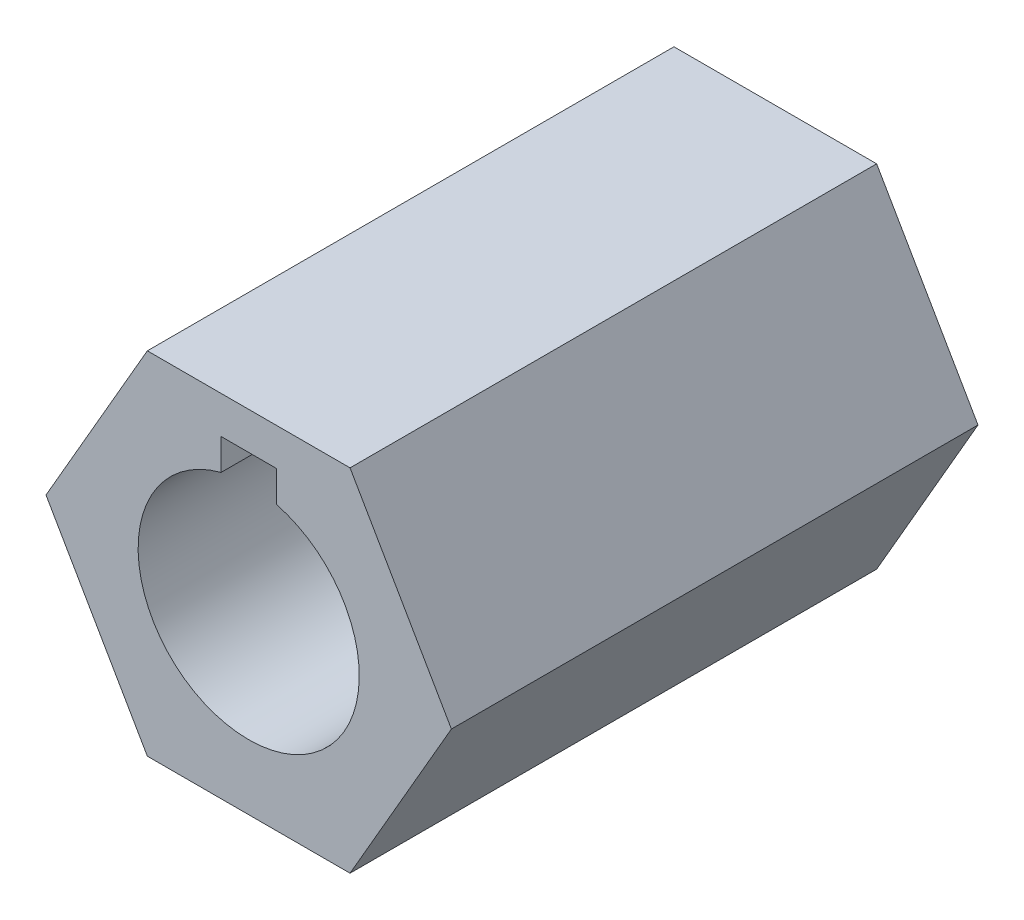
ISO-10303-21;
HEADER;
FILE_DESCRIPTION(('STEP AP214'),'2;1');
FILE_NAME('part.step','',(''),(''),'','','');
FILE_SCHEMA(('AUTOMOTIVE_DESIGN { 1 0 10303 214 1 1 1 1 }'));
ENDSEC;
DATA;
#1=APPLICATION_CONTEXT('core data for automotive mechanical design processes');
#2=APPLICATION_PROTOCOL_DEFINITION('international standard','automotive_design',2000,#1);
#3=PRODUCT_CONTEXT('',#1,'mechanical');
#4=PRODUCT('Part','Part','',(#3));
#5=PRODUCT_RELATED_PRODUCT_CATEGORY('part','',(#4));
#6=PRODUCT_DEFINITION_FORMATION('','',#4);
#7=PRODUCT_DEFINITION_CONTEXT('part definition',#1,'design');
#8=PRODUCT_DEFINITION('design','',#6,#7);
#9=PRODUCT_DEFINITION_SHAPE('','',#8);
#10=(LENGTH_UNIT() NAMED_UNIT(*) SI_UNIT(.MILLI.,.METRE.));
#11=(NAMED_UNIT(*) PLANE_ANGLE_UNIT() SI_UNIT($,.RADIAN.));
#12=(NAMED_UNIT(*) SI_UNIT($,.STERADIAN.) SOLID_ANGLE_UNIT());
#13=UNCERTAINTY_MEASURE_WITH_UNIT(LENGTH_MEASURE(1.E-05),#10,'distance_accuracy_value','');
#14=(GEOMETRIC_REPRESENTATION_CONTEXT(3) GLOBAL_UNCERTAINTY_ASSIGNED_CONTEXT((#13)) GLOBAL_UNIT_ASSIGNED_CONTEXT((#10,
#11,#12)) REPRESENTATION_CONTEXT('',''));
#15=CARTESIAN_POINT('',(0.,0.,0.));
#16=DIRECTION('',(0.,0.,1.));
#17=DIRECTION('',(1.,0.,0.));
#18=AXIS2_PLACEMENT_3D('',#15,#16,#17);
#19=CARTESIAN_POINT('',(0.,-6.34999999999997,19.05));
#20=DIRECTION('',(0.,1.,0.));
#21=DIRECTION('',(-1.,0.,0.));
#22=AXIS2_PLACEMENT_3D('',#19,#20,#21);
#23=PLANE('',#22);
#24=DIRECTION('',(1.,0.,0.));
#25=VECTOR('',#24,1.);
#26=CARTESIAN_POINT('',(0.,-6.34999999999997,0.));
#27=LINE('',#26,#25);
#28=CARTESIAN_POINT('',(-3.66617420935405,-6.35000000000001,0.));
#29=VERTEX_POINT('',#28);
#30=CARTESIAN_POINT('',(3.66617420935418,-6.34999999999993,0.));
#31=VERTEX_POINT('',#30);
#32=EDGE_CURVE('E161',#29,#31,#27,.T.);
#33=ORIENTED_EDGE('',*,*,#32,.T.);
#34=DIRECTION('',(0.,0.,-1.));
#35=VECTOR('',#34,1.);
#36=CARTESIAN_POINT('',(3.66617420935418,-6.34999999999993,19.05));
#37=LINE('',#36,#35);
#38=CARTESIAN_POINT('',(3.66617420935418,-6.34999999999993,19.05));
#39=VERTEX_POINT('',#38);
#40=EDGE_CURVE('E11',#39,#31,#37,.T.);
#41=ORIENTED_EDGE('',*,*,#40,.F.);
#42=DIRECTION('',(1.,0.,0.));
#43=VECTOR('',#42,1.);
#44=CARTESIAN_POINT('',(0.,-6.34999999999997,19.05));
#45=LINE('',#44,#43);
#46=CARTESIAN_POINT('',(-3.66617420935405,-6.35000000000001,19.05));
#47=VERTEX_POINT('',#46);
#48=EDGE_CURVE('E241',#47,#39,#45,.T.);
#49=ORIENTED_EDGE('',*,*,#48,.F.);
#50=DIRECTION('',(0.,0.,-1.));
#51=VECTOR('',#50,1.);
#52=CARTESIAN_POINT('',(-3.66617420935405,-6.35000000000001,19.05));
#53=LINE('',#52,#51);
#54=EDGE_CURVE('E172',#47,#29,#53,.T.);
#55=ORIENTED_EDGE('',*,*,#54,.T.);
#56=EDGE_LOOP('',(#33,#41,#49,#55));
#57=FACE_BOUND('',#56,.T.);
#58=ADVANCED_FACE('F37',(#57),#23,.F.);
#59=CARTESIAN_POINT('',(5.4992613140312,-3.17499999999997,19.05));
#60=DIRECTION('',(-0.866025403784442,0.499999999999995,0.));
#61=DIRECTION('',(-0.499999999999995,-0.866025403784442,0.));
#62=AXIS2_PLACEMENT_3D('',#59,#60,#61);
#63=PLANE('',#62);
#64=DIRECTION('',(0.499999999999995,0.866025403784442,0.));
#65=VECTOR('',#64,1.);
#66=CARTESIAN_POINT('',(5.4992613140312,-3.17499999999997,0.));
#67=LINE('',#66,#65);
#68=CARTESIAN_POINT('',(7.33234841870822,0.,0.));
#69=VERTEX_POINT('',#68);
#70=EDGE_CURVE('E164',#31,#69,#67,.T.);
#71=ORIENTED_EDGE('',*,*,#70,.T.);
#72=DIRECTION('',(0.,0.,-1.));
#73=VECTOR('',#72,1.);
#74=CARTESIAN_POINT('',(7.33234841870822,0.,19.05));
#75=LINE('',#74,#73);
#76=CARTESIAN_POINT('',(7.33234841870822,0.,19.05));
#77=VERTEX_POINT('',#76);
#78=EDGE_CURVE('E47',#77,#69,#75,.T.);
#79=ORIENTED_EDGE('',*,*,#78,.F.);
#80=DIRECTION('',(0.499999999999995,0.866025403784442,0.));
#81=VECTOR('',#80,1.);
#82=CARTESIAN_POINT('',(5.4992613140312,-3.17499999999997,19.05));
#83=LINE('',#82,#81);
#84=EDGE_CURVE('E243',#39,#77,#83,.T.);
#85=ORIENTED_EDGE('',*,*,#84,.F.);
#86=ORIENTED_EDGE('',*,*,#40,.T.);
#87=EDGE_LOOP('',(#71,#79,#85,#86));
#88=FACE_BOUND('',#87,.T.);
#89=ADVANCED_FACE('F210',(#88),#63,.F.);
#90=CARTESIAN_POINT('',(5.49926131403116,3.17499999999999,19.05));
#91=DIRECTION('',(-0.866025403784438,-0.500000000000001,0.));
#92=DIRECTION('',(0.500000000000001,-0.866025403784438,0.));
#93=AXIS2_PLACEMENT_3D('',#90,#91,#92);
#94=PLANE('',#93);
#95=DIRECTION('',(-0.500000000000001,0.866025403784438,0.));
#96=VECTOR('',#95,1.);
#97=CARTESIAN_POINT('',(5.49926131403116,3.17499999999999,0.));
#98=LINE('',#97,#96);
#99=CARTESIAN_POINT('',(3.6661742093541,6.34999999999999,0.));
#100=VERTEX_POINT('',#99);
#101=EDGE_CURVE('E166',#69,#100,#98,.T.);
#102=ORIENTED_EDGE('',*,*,#101,.T.);
#103=DIRECTION('',(0.,0.,-1.));
#104=VECTOR('',#103,1.);
#105=CARTESIAN_POINT('',(3.6661742093541,6.34999999999999,19.05));
#106=LINE('',#105,#104);
#107=CARTESIAN_POINT('',(3.6661742093541,6.34999999999999,19.05));
#108=VERTEX_POINT('',#107);
#109=EDGE_CURVE('E140',#108,#100,#106,.T.);
#110=ORIENTED_EDGE('',*,*,#109,.F.);
#111=DIRECTION('',(-0.500000000000001,0.866025403784438,0.));
#112=VECTOR('',#111,1.);
#113=CARTESIAN_POINT('',(5.49926131403116,3.17499999999999,19.05));
#114=LINE('',#113,#112);
#115=EDGE_CURVE('E131',#77,#108,#114,.T.);
#116=ORIENTED_EDGE('',*,*,#115,.F.);
#117=ORIENTED_EDGE('',*,*,#78,.T.);
#118=EDGE_LOOP('',(#102,#110,#116,#117));
#119=FACE_BOUND('',#118,.T.);
#120=ADVANCED_FACE('F216',(#119),#94,.F.);
#121=CARTESIAN_POINT('',(0.,6.34999999999997,19.05));
#122=DIRECTION('',(0.,-1.,0.));
#123=DIRECTION('',(1.,0.,0.));
#124=AXIS2_PLACEMENT_3D('',#121,#122,#123);
#125=PLANE('',#124);
#126=DIRECTION('',(-1.,0.,0.));
#127=VECTOR('',#126,1.);
#128=CARTESIAN_POINT('',(0.,6.34999999999997,0.));
#129=LINE('',#128,#127);
#130=CARTESIAN_POINT('',(-3.66617420935414,6.34999999999996,0.));
#131=VERTEX_POINT('',#130);
#132=EDGE_CURVE('E139',#100,#131,#129,.T.);
#133=ORIENTED_EDGE('',*,*,#132,.T.);
#134=DIRECTION('',(0.,0.,-1.));
#135=VECTOR('',#134,1.);
#136=CARTESIAN_POINT('',(-3.66617420935414,6.34999999999996,19.05));
#137=LINE('',#136,#135);
#138=CARTESIAN_POINT('',(-3.66617420935414,6.34999999999996,19.05));
#139=VERTEX_POINT('',#138);
#140=EDGE_CURVE('E136',#139,#131,#137,.T.);
#141=ORIENTED_EDGE('',*,*,#140,.F.);
#142=DIRECTION('',(-1.,0.,0.));
#143=VECTOR('',#142,1.);
#144=CARTESIAN_POINT('',(0.,6.34999999999997,19.05));
#145=LINE('',#144,#143);
#146=EDGE_CURVE('E125',#108,#139,#145,.T.);
#147=ORIENTED_EDGE('',*,*,#146,.F.);
#148=ORIENTED_EDGE('',*,*,#109,.T.);
#149=EDGE_LOOP('',(#133,#141,#147,#148));
#150=FACE_BOUND('',#149,.T.);
#151=ADVANCED_FACE('F137',(#150),#125,.F.);
#152=CARTESIAN_POINT('',(-5.49926131403118,3.17499999999995,19.05));
#153=DIRECTION('',(0.866025403784442,-0.499999999999995,0.));
#154=DIRECTION('',(0.499999999999995,0.866025403784442,0.));
#155=AXIS2_PLACEMENT_3D('',#152,#153,#154);
#156=PLANE('',#155);
#157=DIRECTION('',(-0.499999999999995,-0.866025403784442,0.));
#158=VECTOR('',#157,1.);
#159=CARTESIAN_POINT('',(-5.49926131403118,3.17499999999995,0.));
#160=LINE('',#159,#158);
#161=CARTESIAN_POINT('',(-7.33234841870822,0.,0.));
#162=VERTEX_POINT('',#161);
#163=EDGE_CURVE('E91',#131,#162,#160,.T.);
#164=ORIENTED_EDGE('',*,*,#163,.T.);
#165=DIRECTION('',(0.,0.,-1.));
#166=VECTOR('',#165,1.);
#167=CARTESIAN_POINT('',(-7.33234841870822,0.,19.05));
#168=LINE('',#167,#166);
#169=CARTESIAN_POINT('',(-7.33234841870822,0.,19.05));
#170=VERTEX_POINT('',#169);
#171=EDGE_CURVE('E141',#170,#162,#168,.T.);
#172=ORIENTED_EDGE('',*,*,#171,.F.);
#173=DIRECTION('',(-0.499999999999995,-0.866025403784442,0.));
#174=VECTOR('',#173,1.);
#175=CARTESIAN_POINT('',(-5.49926131403118,3.17499999999995,19.05));
#176=LINE('',#175,#174);
#177=EDGE_CURVE('E129',#139,#170,#176,.T.);
#178=ORIENTED_EDGE('',*,*,#177,.F.);
#179=ORIENTED_EDGE('',*,*,#140,.T.);
#180=EDGE_LOOP('',(#164,#172,#178,#179));
#181=FACE_BOUND('',#180,.T.);
#182=ADVANCED_FACE('F143',(#181),#156,.F.);
#183=CARTESIAN_POINT('',(0.,0.,19.05));
#184=DIRECTION('',(0.,0.,-1.));
#185=DIRECTION('',(-1.,0.,0.));
#186=AXIS2_PLACEMENT_3D('',#183,#184,#185);
#187=CYLINDRICAL_SURFACE('',#186,4.);
#188=CARTESIAN_POINT('',(0.,0.,0.));
#189=DIRECTION('',(0.,0.,1.));
#190=DIRECTION('',(1.,0.,0.));
#191=AXIS2_PLACEMENT_3D('',#188,#189,#190);
#192=CIRCLE('',#191,4.);
#193=CARTESIAN_POINT('',(-0.999999999999999,3.87298334620742,0.));
#194=VERTEX_POINT('',#193);
#195=CARTESIAN_POINT('',(1.,3.87298334620742,0.));
#196=VERTEX_POINT('',#195);
#197=EDGE_CURVE('E149',#194,#196,#192,.T.);
#198=ORIENTED_EDGE('',*,*,#197,.F.);
#199=DIRECTION('',(0.,0.,-1.));
#200=VECTOR('',#199,1.);
#201=CARTESIAN_POINT('',(-0.999999999999999,3.87298334620742,19.05));
#202=LINE('',#201,#200);
#203=CARTESIAN_POINT('',(-0.999999999999999,3.87298334620742,19.05));
#204=VERTEX_POINT('',#203);
#205=EDGE_CURVE('E41',#204,#194,#202,.T.);
#206=ORIENTED_EDGE('',*,*,#205,.F.);
#207=CARTESIAN_POINT('',(0.,0.,19.05));
#208=DIRECTION('',(0.,0.,1.));
#209=DIRECTION('',(1.,0.,0.));
#210=AXIS2_PLACEMENT_3D('',#207,#208,#209);
#211=CIRCLE('',#210,4.);
#212=CARTESIAN_POINT('',(1.,3.87298334620742,19.05));
#213=VERTEX_POINT('',#212);
#214=EDGE_CURVE('E171',#204,#213,#211,.T.);
#215=ORIENTED_EDGE('',*,*,#214,.T.);
#216=DIRECTION('',(0.,0.,-1.));
#217=VECTOR('',#216,1.);
#218=CARTESIAN_POINT('',(1.,3.87298334620742,19.05));
#219=LINE('',#218,#217);
#220=EDGE_CURVE('E145',#213,#196,#219,.T.);
#221=ORIENTED_EDGE('',*,*,#220,.T.);
#222=EDGE_LOOP('',(#198,#206,#215,#221));
#223=FACE_BOUND('',#222,.T.);
#224=ADVANCED_FACE('F39',(#223),#187,.F.);
#225=CARTESIAN_POINT('',(-0.999999999999999,0.,19.05));
#226=DIRECTION('',(-1.,0.,0.));
#227=DIRECTION('',(0.,0.,1.));
#228=AXIS2_PLACEMENT_3D('',#225,#226,#227);
#229=PLANE('',#228);
#230=DIRECTION('',(0.,1.,0.));
#231=VECTOR('',#230,1.);
#232=CARTESIAN_POINT('',(-0.999999999999999,0.,0.));
#233=LINE('',#232,#231);
#234=CARTESIAN_POINT('',(-0.999999999999999,5.,0.));
#235=VERTEX_POINT('',#234);
#236=EDGE_CURVE('E152',#194,#235,#233,.T.);
#237=ORIENTED_EDGE('',*,*,#236,.T.);
#238=DIRECTION('',(0.,0.,-1.));
#239=VECTOR('',#238,1.);
#240=CARTESIAN_POINT('',(-0.999999999999999,5.,19.05));
#241=LINE('',#240,#239);
#242=CARTESIAN_POINT('',(-0.999999999999999,5.,19.05));
#243=VERTEX_POINT('',#242);
#244=EDGE_CURVE('E180',#243,#235,#241,.T.);
#245=ORIENTED_EDGE('',*,*,#244,.F.);
#246=DIRECTION('',(0.,1.,0.));
#247=VECTOR('',#246,1.);
#248=CARTESIAN_POINT('',(-0.999999999999999,0.,19.05));
#249=LINE('',#248,#247);
#250=EDGE_CURVE('E188',#204,#243,#249,.T.);
#251=ORIENTED_EDGE('',*,*,#250,.F.);
#252=ORIENTED_EDGE('',*,*,#205,.T.);
#253=EDGE_LOOP('',(#237,#245,#251,#252));
#254=FACE_BOUND('',#253,.T.);
#255=ADVANCED_FACE('F187',(#254),#229,.F.);
#256=CARTESIAN_POINT('',(0.,5.,19.05));
#257=DIRECTION('',(0.,-1.,0.));
#258=DIRECTION('',(0.,0.,-1.));
#259=AXIS2_PLACEMENT_3D('',#256,#257,#258);
#260=PLANE('',#259);
#261=DIRECTION('',(-1.,0.,0.));
#262=VECTOR('',#261,1.);
#263=CARTESIAN_POINT('',(0.,5.,0.));
#264=LINE('',#263,#262);
#265=CARTESIAN_POINT('',(1.,5.,0.));
#266=VERTEX_POINT('',#265);
#267=EDGE_CURVE('E155',#266,#235,#264,.T.);
#268=ORIENTED_EDGE('',*,*,#267,.F.);
#269=DIRECTION('',(0.,0.,-1.));
#270=VECTOR('',#269,1.);
#271=CARTESIAN_POINT('',(1.,5.,19.05));
#272=LINE('',#271,#270);
#273=CARTESIAN_POINT('',(1.,5.,19.05));
#274=VERTEX_POINT('',#273);
#275=EDGE_CURVE('E179',#274,#266,#272,.T.);
#276=ORIENTED_EDGE('',*,*,#275,.F.);
#277=DIRECTION('',(-1.,0.,0.));
#278=VECTOR('',#277,1.);
#279=CARTESIAN_POINT('',(0.,5.,19.05));
#280=LINE('',#279,#278);
#281=EDGE_CURVE('E236',#274,#243,#280,.T.);
#282=ORIENTED_EDGE('',*,*,#281,.T.);
#283=ORIENTED_EDGE('',*,*,#244,.T.);
#284=EDGE_LOOP('',(#268,#276,#282,#283));
#285=FACE_BOUND('',#284,.T.);
#286=ADVANCED_FACE('F200',(#285),#260,.T.);
#287=CARTESIAN_POINT('',(1.,0.,19.05));
#288=DIRECTION('',(-1.,0.,0.));
#289=DIRECTION('',(0.,0.,1.));
#290=AXIS2_PLACEMENT_3D('',#287,#288,#289);
#291=PLANE('',#290);
#292=DIRECTION('',(0.,1.,0.));
#293=VECTOR('',#292,1.);
#294=CARTESIAN_POINT('',(1.,0.,0.));
#295=LINE('',#294,#293);
#296=EDGE_CURVE('E158',#196,#266,#295,.T.);
#297=ORIENTED_EDGE('',*,*,#296,.F.);
#298=ORIENTED_EDGE('',*,*,#220,.F.);
#299=DIRECTION('',(0.,1.,0.));
#300=VECTOR('',#299,1.);
#301=CARTESIAN_POINT('',(1.,0.,19.05));
#302=LINE('',#301,#300);
#303=EDGE_CURVE('E198',#213,#274,#302,.T.);
#304=ORIENTED_EDGE('',*,*,#303,.T.);
#305=ORIENTED_EDGE('',*,*,#275,.T.);
#306=EDGE_LOOP('',(#297,#298,#304,#305));
#307=FACE_BOUND('',#306,.T.);
#308=ADVANCED_FACE('F197',(#307),#291,.T.);
#309=CARTESIAN_POINT('',(-5.49926131403114,-3.17500000000003,19.05));
#310=DIRECTION('',(0.866025403784434,0.500000000000007,0.));
#311=DIRECTION('',(-0.500000000000007,0.866025403784435,0.));
#312=AXIS2_PLACEMENT_3D('',#309,#310,#311);
#313=PLANE('',#312);
#314=DIRECTION('',(0.500000000000007,-0.866025403784435,0.));
#315=VECTOR('',#314,1.);
#316=CARTESIAN_POINT('',(-5.49926131403114,-3.17500000000003,0.));
#317=LINE('',#316,#315);
#318=EDGE_CURVE('E97',#162,#29,#317,.T.);
#319=ORIENTED_EDGE('',*,*,#318,.T.);
#320=ORIENTED_EDGE('',*,*,#54,.F.);
#321=DIRECTION('',(0.500000000000007,-0.866025403784435,0.));
#322=VECTOR('',#321,1.);
#323=CARTESIAN_POINT('',(-5.49926131403114,-3.17500000000003,19.05));
#324=LINE('',#323,#322);
#325=EDGE_CURVE('E56',#170,#47,#324,.T.);
#326=ORIENTED_EDGE('',*,*,#325,.F.);
#327=ORIENTED_EDGE('',*,*,#171,.T.);
#328=EDGE_LOOP('',(#319,#320,#326,#327));
#329=FACE_BOUND('',#328,.T.);
#330=ADVANCED_FACE('F207',(#329),#313,.F.);
#331=CARTESIAN_POINT('',(0.,0.,19.05));
#332=DIRECTION('',(0.,0.,1.));
#333=DIRECTION('',(1.,0.,0.));
#334=AXIS2_PLACEMENT_3D('',#331,#332,#333);
#335=PLANE('',#334);
#336=ORIENTED_EDGE('',*,*,#214,.F.);
#337=ORIENTED_EDGE('',*,*,#250,.T.);
#338=ORIENTED_EDGE('',*,*,#281,.F.);
#339=ORIENTED_EDGE('',*,*,#303,.F.);
#340=EDGE_LOOP('',(#336,#337,#338,#339));
#341=FACE_BOUND('',#340,.T.);
#342=ORIENTED_EDGE('',*,*,#48,.T.);
#343=ORIENTED_EDGE('',*,*,#84,.T.);
#344=ORIENTED_EDGE('',*,*,#115,.T.);
#345=ORIENTED_EDGE('',*,*,#146,.T.);
#346=ORIENTED_EDGE('',*,*,#177,.T.);
#347=ORIENTED_EDGE('',*,*,#325,.T.);
#348=EDGE_LOOP('',(#342,#343,#344,#345,#346,#347));
#349=FACE_BOUND('',#348,.T.);
#350=ADVANCED_FACE('F127',(#341,#349),#335,.T.);
#351=CARTESIAN_POINT('',(0.,0.,0.));
#352=DIRECTION('',(0.,0.,1.));
#353=DIRECTION('',(1.,0.,0.));
#354=AXIS2_PLACEMENT_3D('',#351,#352,#353);
#355=PLANE('',#354);
#356=ORIENTED_EDGE('',*,*,#197,.T.);
#357=ORIENTED_EDGE('',*,*,#296,.T.);
#358=ORIENTED_EDGE('',*,*,#267,.T.);
#359=ORIENTED_EDGE('',*,*,#236,.F.);
#360=EDGE_LOOP('',(#356,#357,#358,#359));
#361=FACE_BOUND('',#360,.T.);
#362=ORIENTED_EDGE('',*,*,#32,.F.);
#363=ORIENTED_EDGE('',*,*,#318,.F.);
#364=ORIENTED_EDGE('',*,*,#163,.F.);
#365=ORIENTED_EDGE('',*,*,#132,.F.);
#366=ORIENTED_EDGE('',*,*,#101,.F.);
#367=ORIENTED_EDGE('',*,*,#70,.F.);
#368=EDGE_LOOP('',(#362,#363,#364,#365,#366,#367));
#369=FACE_BOUND('',#368,.T.);
#370=ADVANCED_FACE('F191',(#361,#369),#355,.F.);
#371=CLOSED_SHELL('',(#58,#89,#120,#151,#182,#224,#255,#286,#308,#330,#350,#370));
#372=MANIFOLD_SOLID_BREP('B2',#371);
#373=ADVANCED_BREP_SHAPE_REPRESENTATION('',(#18,#372),#14);
#374=SHAPE_DEFINITION_REPRESENTATION(#9,#373);
ENDSEC;
END-ISO-10303-21;
